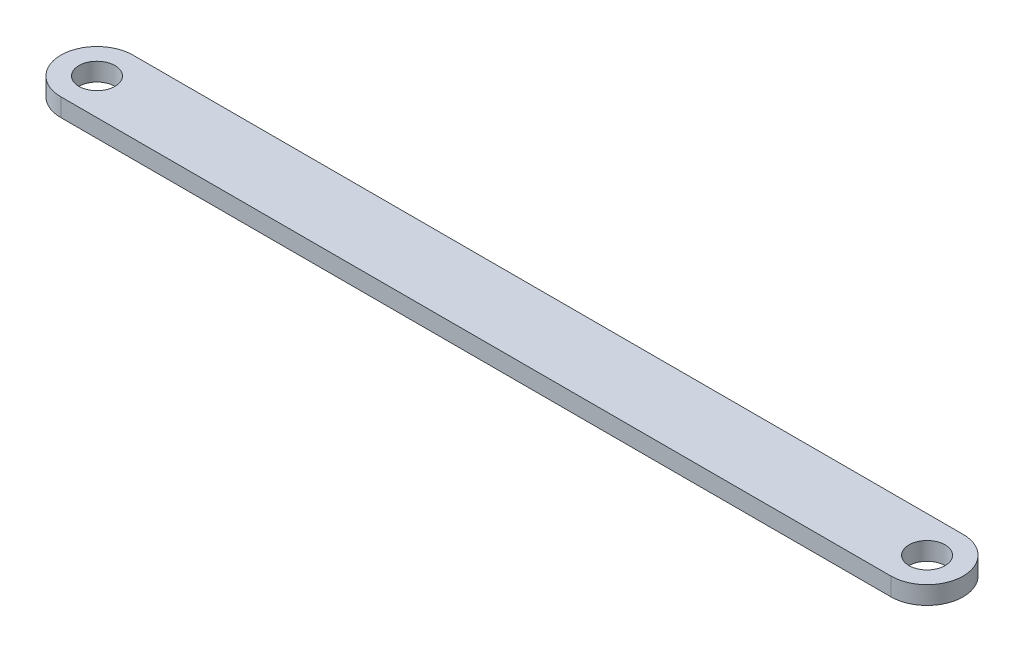
ISO-10303-21;
HEADER;
FILE_DESCRIPTION(('STEP AP214'),'2;1');
FILE_NAME('part.step','',(''),(''),'','','');
FILE_SCHEMA(('AUTOMOTIVE_DESIGN { 1 0 10303 214 1 1 1 1 }'));
ENDSEC;
DATA;
#1=APPLICATION_CONTEXT('core data for automotive mechanical design processes');
#2=APPLICATION_PROTOCOL_DEFINITION('international standard','automotive_design',2000,#1);
#3=PRODUCT_CONTEXT('',#1,'mechanical');
#4=PRODUCT('Part','Part','',(#3));
#5=PRODUCT_RELATED_PRODUCT_CATEGORY('part','',(#4));
#6=PRODUCT_DEFINITION_FORMATION('','',#4);
#7=PRODUCT_DEFINITION_CONTEXT('part definition',#1,'design');
#8=PRODUCT_DEFINITION('design','',#6,#7);
#9=PRODUCT_DEFINITION_SHAPE('','',#8);
#10=(LENGTH_UNIT() NAMED_UNIT(*) SI_UNIT(.MILLI.,.METRE.));
#11=(NAMED_UNIT(*) PLANE_ANGLE_UNIT() SI_UNIT($,.RADIAN.));
#12=(NAMED_UNIT(*) SI_UNIT($,.STERADIAN.) SOLID_ANGLE_UNIT());
#13=UNCERTAINTY_MEASURE_WITH_UNIT(LENGTH_MEASURE(1.E-05),#10,'distance_accuracy_value','');
#14=(GEOMETRIC_REPRESENTATION_CONTEXT(3) GLOBAL_UNCERTAINTY_ASSIGNED_CONTEXT((#13)) GLOBAL_UNIT_ASSIGNED_CONTEXT((#10,
#11,#12)) REPRESENTATION_CONTEXT('',''));
#15=CARTESIAN_POINT('',(0.,0.,0.));
#16=DIRECTION('',(0.,0.,1.));
#17=DIRECTION('',(1.,0.,0.));
#18=AXIS2_PLACEMENT_3D('',#15,#16,#17);
#19=CARTESIAN_POINT('',(-72.3468097091892,5.,0.));
#20=DIRECTION('',(0.,1.,0.));
#21=DIRECTION('',(0.,0.,1.));
#22=AXIS2_PLACEMENT_3D('',#19,#20,#21);
#23=PLANE('',#22);
#24=CARTESIAN_POINT('',(-72.3468097091892,5.,0.));
#25=DIRECTION('',(0.,1.,0.));
#26=DIRECTION('',(0.,0.,1.));
#27=AXIS2_PLACEMENT_3D('',#24,#25,#26);
#28=CIRCLE('',#27,5.);
#29=CARTESIAN_POINT('',(-72.3468097091892,5.,5.));
#30=VERTEX_POINT('',#29);
#31=EDGE_CURVE('E116',#30,#30,#28,.T.);
#32=ORIENTED_EDGE('',*,*,#31,.F.);
#33=EDGE_LOOP('',(#32));
#34=FACE_BOUND('',#33,.T.);
#35=CARTESIAN_POINT('',(-72.3468097091892,5.,0.));
#36=DIRECTION('',(0.,1.,0.));
#37=DIRECTION('',(0.,0.,1.));
#38=AXIS2_PLACEMENT_3D('',#35,#36,#37);
#39=CIRCLE('',#38,10.);
#40=CARTESIAN_POINT('',(-72.3468097091892,5.,-10.));
#41=VERTEX_POINT('',#40);
#42=CARTESIAN_POINT('',(-72.3468097091892,5.,10.));
#43=VERTEX_POINT('',#42);
#44=EDGE_CURVE('E96',#41,#43,#39,.T.);
#45=ORIENTED_EDGE('',*,*,#44,.T.);
#46=DIRECTION('',(1.,0.,0.));
#47=VECTOR('',#46,1.);
#48=CARTESIAN_POINT('',(-72.3468097091892,5.,10.));
#49=LINE('',#48,#47);
#50=CARTESIAN_POINT('',(157.653190290811,5.,10.));
#51=VERTEX_POINT('',#50);
#52=EDGE_CURVE('E91',#43,#51,#49,.T.);
#53=ORIENTED_EDGE('',*,*,#52,.T.);
#54=CARTESIAN_POINT('',(157.653190290811,5.,0.));
#55=DIRECTION('',(0.,1.,0.));
#56=DIRECTION('',(0.,0.,1.));
#57=AXIS2_PLACEMENT_3D('',#54,#55,#56);
#58=CIRCLE('',#57,10.);
#59=CARTESIAN_POINT('',(157.653190290811,5.,-10.));
#60=VERTEX_POINT('',#59);
#61=EDGE_CURVE('E94',#51,#60,#58,.T.);
#62=ORIENTED_EDGE('',*,*,#61,.T.);
#63=DIRECTION('',(-1.,0.,0.));
#64=VECTOR('',#63,1.);
#65=CARTESIAN_POINT('',(-72.3468097091892,5.,-10.));
#66=LINE('',#65,#64);
#67=EDGE_CURVE('E61',#60,#41,#66,.T.);
#68=ORIENTED_EDGE('',*,*,#67,.T.);
#69=EDGE_LOOP('',(#45,#53,#62,#68));
#70=FACE_BOUND('',#69,.T.);
#71=CARTESIAN_POINT('',(157.653190290811,5.,0.));
#72=DIRECTION('',(0.,1.,0.));
#73=DIRECTION('',(0.,0.,1.));
#74=AXIS2_PLACEMENT_3D('',#71,#72,#73);
#75=CIRCLE('',#74,4.99999999999999);
#76=CARTESIAN_POINT('',(157.653190290811,5.,4.99999999999999));
#77=VERTEX_POINT('',#76);
#78=EDGE_CURVE('E138',#77,#77,#75,.T.);
#79=ORIENTED_EDGE('',*,*,#78,.F.);
#80=EDGE_LOOP('',(#79));
#81=FACE_BOUND('',#80,.T.);
#82=ADVANCED_FACE('F43',(#34,#70,#81),#23,.T.);
#83=CARTESIAN_POINT('',(-72.3468097091892,0.,0.));
#84=DIRECTION('',(0.,1.,0.));
#85=DIRECTION('',(0.,0.,1.));
#86=AXIS2_PLACEMENT_3D('',#83,#84,#85);
#87=PLANE('',#86);
#88=CARTESIAN_POINT('',(-72.3468097091892,0.,0.));
#89=DIRECTION('',(0.,1.,0.));
#90=DIRECTION('',(0.,0.,1.));
#91=AXIS2_PLACEMENT_3D('',#88,#89,#90);
#92=CIRCLE('',#91,10.);
#93=CARTESIAN_POINT('',(-72.3468097091892,0.,-10.));
#94=VERTEX_POINT('',#93);
#95=CARTESIAN_POINT('',(-72.3468097091892,0.,10.));
#96=VERTEX_POINT('',#95);
#97=EDGE_CURVE('E112',#94,#96,#92,.T.);
#98=ORIENTED_EDGE('',*,*,#97,.F.);
#99=DIRECTION('',(-1.,0.,0.));
#100=VECTOR('',#99,1.);
#101=CARTESIAN_POINT('',(-72.3468097091892,0.,-10.));
#102=LINE('',#101,#100);
#103=CARTESIAN_POINT('',(157.653190290811,0.,-10.));
#104=VERTEX_POINT('',#103);
#105=EDGE_CURVE('E84',#104,#94,#102,.T.);
#106=ORIENTED_EDGE('',*,*,#105,.F.);
#107=CARTESIAN_POINT('',(157.653190290811,0.,0.));
#108=DIRECTION('',(0.,1.,0.));
#109=DIRECTION('',(0.,0.,1.));
#110=AXIS2_PLACEMENT_3D('',#107,#108,#109);
#111=CIRCLE('',#110,10.);
#112=CARTESIAN_POINT('',(157.653190290811,0.,10.));
#113=VERTEX_POINT('',#112);
#114=EDGE_CURVE('E78',#113,#104,#111,.T.);
#115=ORIENTED_EDGE('',*,*,#114,.F.);
#116=DIRECTION('',(1.,0.,0.));
#117=VECTOR('',#116,1.);
#118=CARTESIAN_POINT('',(-72.3468097091892,0.,10.));
#119=LINE('',#118,#117);
#120=EDGE_CURVE('E101',#96,#113,#119,.T.);
#121=ORIENTED_EDGE('',*,*,#120,.F.);
#122=EDGE_LOOP('',(#98,#106,#115,#121));
#123=FACE_BOUND('',#122,.T.);
#124=CARTESIAN_POINT('',(-72.3468097091892,0.,0.));
#125=DIRECTION('',(0.,1.,0.));
#126=DIRECTION('',(0.,0.,1.));
#127=AXIS2_PLACEMENT_3D('',#124,#125,#126);
#128=CIRCLE('',#127,5.);
#129=CARTESIAN_POINT('',(-72.3468097091892,0.,5.));
#130=VERTEX_POINT('',#129);
#131=EDGE_CURVE('E134',#130,#130,#128,.T.);
#132=ORIENTED_EDGE('',*,*,#131,.T.);
#133=EDGE_LOOP('',(#132));
#134=FACE_BOUND('',#133,.T.);
#135=CARTESIAN_POINT('',(157.653190290811,0.,0.));
#136=DIRECTION('',(0.,1.,0.));
#137=DIRECTION('',(0.,0.,1.));
#138=AXIS2_PLACEMENT_3D('',#135,#136,#137);
#139=CIRCLE('',#138,4.99999999999999);
#140=CARTESIAN_POINT('',(157.653190290811,0.,4.99999999999999));
#141=VERTEX_POINT('',#140);
#142=EDGE_CURVE('E142',#141,#141,#139,.T.);
#143=ORIENTED_EDGE('',*,*,#142,.T.);
#144=EDGE_LOOP('',(#143));
#145=FACE_BOUND('',#144,.T.);
#146=ADVANCED_FACE('F129',(#123,#134,#145),#87,.F.);
#147=CARTESIAN_POINT('',(-72.3468097091892,5.,0.));
#148=DIRECTION('',(0.,-1.,0.));
#149=DIRECTION('',(0.,0.,-1.));
#150=AXIS2_PLACEMENT_3D('',#147,#148,#149);
#151=CYLINDRICAL_SURFACE('',#150,10.);
#152=ORIENTED_EDGE('',*,*,#97,.T.);
#153=DIRECTION('',(0.,-1.,0.));
#154=VECTOR('',#153,1.);
#155=CARTESIAN_POINT('',(-72.3468097091892,5.,10.));
#156=LINE('',#155,#154);
#157=EDGE_CURVE('E11',#43,#96,#156,.T.);
#158=ORIENTED_EDGE('',*,*,#157,.F.);
#159=ORIENTED_EDGE('',*,*,#44,.F.);
#160=DIRECTION('',(0.,-1.,0.));
#161=VECTOR('',#160,1.);
#162=CARTESIAN_POINT('',(-72.3468097091892,5.,-10.));
#163=LINE('',#162,#161);
#164=EDGE_CURVE('E108',#41,#94,#163,.T.);
#165=ORIENTED_EDGE('',*,*,#164,.T.);
#166=EDGE_LOOP('',(#152,#158,#159,#165));
#167=FACE_BOUND('',#166,.T.);
#168=ADVANCED_FACE('F45',(#167),#151,.T.);
#169=CARTESIAN_POINT('',(-72.3468097091892,5.,10.));
#170=DIRECTION('',(0.,0.,-1.));
#171=DIRECTION('',(-1.,0.,0.));
#172=AXIS2_PLACEMENT_3D('',#169,#170,#171);
#173=PLANE('',#172);
#174=ORIENTED_EDGE('',*,*,#120,.T.);
#175=DIRECTION('',(0.,-1.,0.));
#176=VECTOR('',#175,1.);
#177=CARTESIAN_POINT('',(157.653190290811,5.,10.));
#178=LINE('',#177,#176);
#179=EDGE_CURVE('E53',#51,#113,#178,.T.);
#180=ORIENTED_EDGE('',*,*,#179,.F.);
#181=ORIENTED_EDGE('',*,*,#52,.F.);
#182=ORIENTED_EDGE('',*,*,#157,.T.);
#183=EDGE_LOOP('',(#174,#180,#181,#182));
#184=FACE_BOUND('',#183,.T.);
#185=ADVANCED_FACE('F100',(#184),#173,.F.);
#186=CARTESIAN_POINT('',(157.653190290811,5.,0.));
#187=DIRECTION('',(0.,-1.,0.));
#188=DIRECTION('',(0.,0.,-1.));
#189=AXIS2_PLACEMENT_3D('',#186,#187,#188);
#190=CYLINDRICAL_SURFACE('',#189,10.);
#191=ORIENTED_EDGE('',*,*,#114,.T.);
#192=DIRECTION('',(0.,-1.,0.));
#193=VECTOR('',#192,1.);
#194=CARTESIAN_POINT('',(157.653190290811,5.,-10.));
#195=LINE('',#194,#193);
#196=EDGE_CURVE('E103',#60,#104,#195,.T.);
#197=ORIENTED_EDGE('',*,*,#196,.F.);
#198=ORIENTED_EDGE('',*,*,#61,.F.);
#199=ORIENTED_EDGE('',*,*,#179,.T.);
#200=EDGE_LOOP('',(#191,#197,#198,#199));
#201=FACE_BOUND('',#200,.T.);
#202=ADVANCED_FACE('F104',(#201),#190,.T.);
#203=CARTESIAN_POINT('',(-72.3468097091892,5.,-10.));
#204=DIRECTION('',(0.,0.,1.));
#205=DIRECTION('',(1.,0.,0.));
#206=AXIS2_PLACEMENT_3D('',#203,#204,#205);
#207=PLANE('',#206);
#208=ORIENTED_EDGE('',*,*,#105,.T.);
#209=ORIENTED_EDGE('',*,*,#164,.F.);
#210=ORIENTED_EDGE('',*,*,#67,.F.);
#211=ORIENTED_EDGE('',*,*,#196,.T.);
#212=EDGE_LOOP('',(#208,#209,#210,#211));
#213=FACE_BOUND('',#212,.T.);
#214=ADVANCED_FACE('F126',(#213),#207,.F.);
#215=CARTESIAN_POINT('',(-72.3468097091892,5.,0.));
#216=DIRECTION('',(0.,-1.,0.));
#217=DIRECTION('',(0.,0.,-1.));
#218=AXIS2_PLACEMENT_3D('',#215,#216,#217);
#219=CYLINDRICAL_SURFACE('',#218,5.);
#220=ORIENTED_EDGE('',*,*,#31,.T.);
#221=EDGE_LOOP('',(#220));
#222=FACE_BOUND('',#221,.T.);
#223=ORIENTED_EDGE('',*,*,#131,.F.);
#224=EDGE_LOOP('',(#223));
#225=FACE_BOUND('',#224,.T.);
#226=ADVANCED_FACE('F161',(#222,#225),#219,.F.);
#227=CARTESIAN_POINT('',(157.653190290811,5.,0.));
#228=DIRECTION('',(0.,-1.,0.));
#229=DIRECTION('',(0.,0.,-1.));
#230=AXIS2_PLACEMENT_3D('',#227,#228,#229);
#231=CYLINDRICAL_SURFACE('',#230,4.99999999999999);
#232=ORIENTED_EDGE('',*,*,#78,.T.);
#233=EDGE_LOOP('',(#232));
#234=FACE_BOUND('',#233,.T.);
#235=ORIENTED_EDGE('',*,*,#142,.F.);
#236=EDGE_LOOP('',(#235));
#237=FACE_BOUND('',#236,.T.);
#238=ADVANCED_FACE('F150',(#234,#237),#231,.F.);
#239=CLOSED_SHELL('',(#82,#146,#168,#185,#202,#214,#226,#238));
#240=MANIFOLD_SOLID_BREP('B2',#239);
#241=ADVANCED_BREP_SHAPE_REPRESENTATION('',(#18,#240),#14);
#242=SHAPE_DEFINITION_REPRESENTATION(#9,#241);
ENDSEC;
END-ISO-10303-21;
